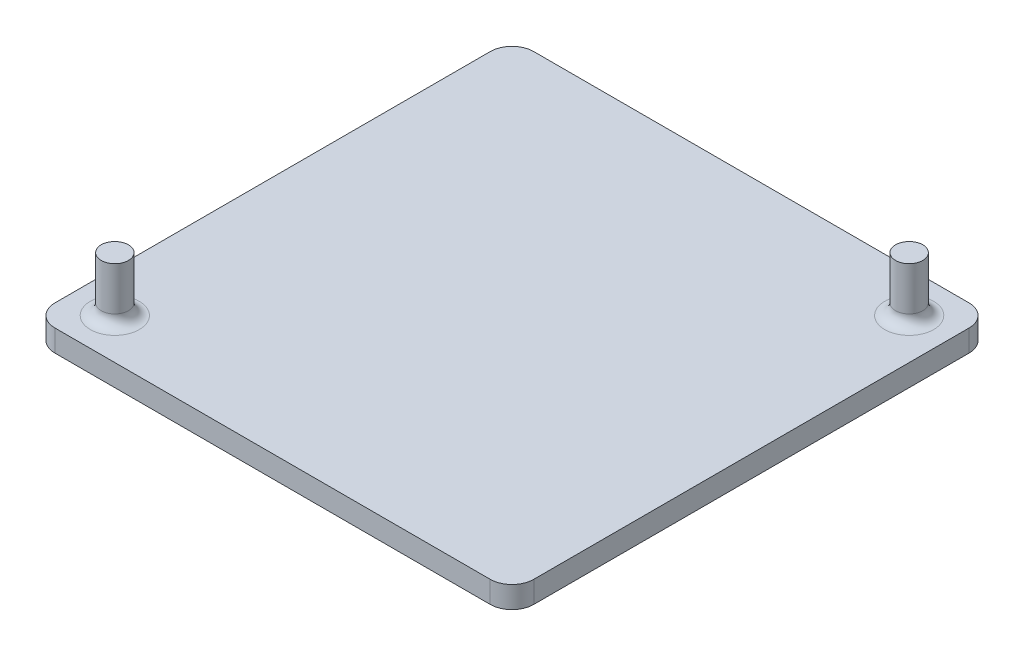
ISO-10303-21;
HEADER;
FILE_DESCRIPTION(('STEP AP214'),'2;1');
FILE_NAME('part.step','',(''),(''),'','','');
FILE_SCHEMA(('AUTOMOTIVE_DESIGN { 1 0 10303 214 1 1 1 1 }'));
ENDSEC;
DATA;
#1=APPLICATION_CONTEXT('core data for automotive mechanical design processes');
#2=APPLICATION_PROTOCOL_DEFINITION('international standard','automotive_design',2000,#1);
#3=PRODUCT_CONTEXT('',#1,'mechanical');
#4=PRODUCT('Part','Part','',(#3));
#5=PRODUCT_RELATED_PRODUCT_CATEGORY('part','',(#4));
#6=PRODUCT_DEFINITION_FORMATION('','',#4);
#7=PRODUCT_DEFINITION_CONTEXT('part definition',#1,'design');
#8=PRODUCT_DEFINITION('design','',#6,#7);
#9=PRODUCT_DEFINITION_SHAPE('','',#8);
#10=(LENGTH_UNIT() NAMED_UNIT(*) SI_UNIT(.MILLI.,.METRE.));
#11=(NAMED_UNIT(*) PLANE_ANGLE_UNIT() SI_UNIT($,.RADIAN.));
#12=(NAMED_UNIT(*) SI_UNIT($,.STERADIAN.) SOLID_ANGLE_UNIT());
#13=UNCERTAINTY_MEASURE_WITH_UNIT(LENGTH_MEASURE(1.E-05),#10,'distance_accuracy_value','');
#14=(GEOMETRIC_REPRESENTATION_CONTEXT(3) GLOBAL_UNCERTAINTY_ASSIGNED_CONTEXT((#13)) GLOBAL_UNIT_ASSIGNED_CONTEXT((#10,
#11,#12)) REPRESENTATION_CONTEXT('',''));
#15=CARTESIAN_POINT('',(0.,0.,0.));
#16=DIRECTION('',(0.,0.,1.));
#17=DIRECTION('',(1.,0.,0.));
#18=AXIS2_PLACEMENT_3D('',#15,#16,#17);
#19=CARTESIAN_POINT('',(0.,2.,0.));
#20=DIRECTION('',(1.,0.,0.));
#21=DIRECTION('',(0.,0.,-1.));
#22=AXIS2_PLACEMENT_3D('',#19,#20,#21);
#23=PLANE('',#22);
#24=DIRECTION('',(0.,0.,1.));
#25=VECTOR('',#24,1.);
#26=CARTESIAN_POINT('',(0.,2.,0.));
#27=LINE('',#26,#25);
#28=CARTESIAN_POINT('',(0.,2.,-42.));
#29=VERTEX_POINT('',#28);
#30=CARTESIAN_POINT('',(0.,2.,-2.));
#31=VERTEX_POINT('',#30);
#32=EDGE_CURVE('E134',#29,#31,#27,.T.);
#33=ORIENTED_EDGE('',*,*,#32,.F.);
#34=DIRECTION('',(0.,-1.,0.));
#35=VECTOR('',#34,1.);
#36=CARTESIAN_POINT('',(0.,2.,-42.));
#37=LINE('',#36,#35);
#38=CARTESIAN_POINT('',(0.,0.,-42.));
#39=VERTEX_POINT('',#38);
#40=EDGE_CURVE('E160',#29,#39,#37,.T.);
#41=ORIENTED_EDGE('',*,*,#40,.T.);
#42=DIRECTION('',(0.,0.,1.));
#43=VECTOR('',#42,1.);
#44=CARTESIAN_POINT('',(0.,0.,0.));
#45=LINE('',#44,#43);
#46=CARTESIAN_POINT('',(0.,0.,-2.));
#47=VERTEX_POINT('',#46);
#48=EDGE_CURVE('E194',#39,#47,#45,.T.);
#49=ORIENTED_EDGE('',*,*,#48,.T.);
#50=DIRECTION('',(0.,-1.,0.));
#51=VECTOR('',#50,1.);
#52=CARTESIAN_POINT('',(0.,2.,-2.));
#53=LINE('',#52,#51);
#54=EDGE_CURVE('E158',#47,#31,#53,.F.);
#55=ORIENTED_EDGE('',*,*,#54,.T.);
#56=EDGE_LOOP('',(#33,#41,#49,#55));
#57=FACE_BOUND('',#56,.T.);
#58=ADVANCED_FACE('F41',(#57),#23,.F.);
#59=CARTESIAN_POINT('',(0.,2.,0.));
#60=DIRECTION('',(0.,0.,-1.));
#61=DIRECTION('',(-1.,0.,0.));
#62=AXIS2_PLACEMENT_3D('',#59,#60,#61);
#63=PLANE('',#62);
#64=DIRECTION('',(1.,0.,0.));
#65=VECTOR('',#64,1.);
#66=CARTESIAN_POINT('',(0.,2.,0.));
#67=LINE('',#66,#65);
#68=CARTESIAN_POINT('',(2.,2.,0.));
#69=VERTEX_POINT('',#68);
#70=CARTESIAN_POINT('',(42.,2.,0.));
#71=VERTEX_POINT('',#70);
#72=EDGE_CURVE('E137',#69,#71,#67,.T.);
#73=ORIENTED_EDGE('',*,*,#72,.F.);
#74=DIRECTION('',(0.,-1.,0.));
#75=VECTOR('',#74,1.);
#76=CARTESIAN_POINT('',(2.,2.,0.));
#77=LINE('',#76,#75);
#78=CARTESIAN_POINT('',(2.,0.,0.));
#79=VERTEX_POINT('',#78);
#80=EDGE_CURVE('E164',#69,#79,#77,.T.);
#81=ORIENTED_EDGE('',*,*,#80,.T.);
#82=DIRECTION('',(1.,0.,0.));
#83=VECTOR('',#82,1.);
#84=CARTESIAN_POINT('',(0.,0.,0.));
#85=LINE('',#84,#83);
#86=CARTESIAN_POINT('',(42.,0.,0.));
#87=VERTEX_POINT('',#86);
#88=EDGE_CURVE('E139',#79,#87,#85,.T.);
#89=ORIENTED_EDGE('',*,*,#88,.T.);
#90=DIRECTION('',(0.,-1.,0.));
#91=VECTOR('',#90,1.);
#92=CARTESIAN_POINT('',(42.,2.,0.));
#93=LINE('',#92,#91);
#94=EDGE_CURVE('E56',#87,#71,#93,.F.);
#95=ORIENTED_EDGE('',*,*,#94,.T.);
#96=EDGE_LOOP('',(#73,#81,#89,#95));
#97=FACE_BOUND('',#96,.T.);
#98=ADVANCED_FACE('F207',(#97),#63,.F.);
#99=CARTESIAN_POINT('',(44.,2.,0.));
#100=DIRECTION('',(-1.,0.,0.));
#101=DIRECTION('',(0.,0.,1.));
#102=AXIS2_PLACEMENT_3D('',#99,#100,#101);
#103=PLANE('',#102);
#104=DIRECTION('',(0.,0.,-1.));
#105=VECTOR('',#104,1.);
#106=CARTESIAN_POINT('',(44.,0.,0.));
#107=LINE('',#106,#105);
#108=CARTESIAN_POINT('',(44.,0.,-2.));
#109=VERTEX_POINT('',#108);
#110=CARTESIAN_POINT('',(44.,0.,-42.));
#111=VERTEX_POINT('',#110);
#112=EDGE_CURVE('E135',#109,#111,#107,.T.);
#113=ORIENTED_EDGE('',*,*,#112,.T.);
#114=DIRECTION('',(0.,-1.,0.));
#115=VECTOR('',#114,1.);
#116=CARTESIAN_POINT('',(44.,2.,-42.));
#117=LINE('',#116,#115);
#118=CARTESIAN_POINT('',(44.,2.,-42.));
#119=VERTEX_POINT('',#118);
#120=EDGE_CURVE('E113',#111,#119,#117,.F.);
#121=ORIENTED_EDGE('',*,*,#120,.T.);
#122=DIRECTION('',(0.,0.,-1.));
#123=VECTOR('',#122,1.);
#124=CARTESIAN_POINT('',(44.,2.,0.));
#125=LINE('',#124,#123);
#126=CARTESIAN_POINT('',(44.,2.,-2.));
#127=VERTEX_POINT('',#126);
#128=EDGE_CURVE('E203',#127,#119,#125,.T.);
#129=ORIENTED_EDGE('',*,*,#128,.F.);
#130=DIRECTION('',(0.,-1.,0.));
#131=VECTOR('',#130,1.);
#132=CARTESIAN_POINT('',(44.,2.,-2.));
#133=LINE('',#132,#131);
#134=EDGE_CURVE('E118',#127,#109,#133,.T.);
#135=ORIENTED_EDGE('',*,*,#134,.T.);
#136=EDGE_LOOP('',(#113,#121,#129,#135));
#137=FACE_BOUND('',#136,.T.);
#138=ADVANCED_FACE('F214',(#137),#103,.F.);
#139=CARTESIAN_POINT('',(0.,2.,-44.));
#140=DIRECTION('',(0.,0.,1.));
#141=DIRECTION('',(1.,0.,0.));
#142=AXIS2_PLACEMENT_3D('',#139,#140,#141);
#143=PLANE('',#142);
#144=DIRECTION('',(-1.,0.,0.));
#145=VECTOR('',#144,1.);
#146=CARTESIAN_POINT('',(0.,2.,-44.));
#147=LINE('',#146,#145);
#148=CARTESIAN_POINT('',(42.,2.,-44.));
#149=VERTEX_POINT('',#148);
#150=CARTESIAN_POINT('',(2.,2.,-44.));
#151=VERTEX_POINT('',#150);
#152=EDGE_CURVE('E128',#149,#151,#147,.T.);
#153=ORIENTED_EDGE('',*,*,#152,.F.);
#154=DIRECTION('',(0.,-1.,0.));
#155=VECTOR('',#154,1.);
#156=CARTESIAN_POINT('',(42.,2.,-44.));
#157=LINE('',#156,#155);
#158=CARTESIAN_POINT('',(42.,0.,-44.));
#159=VERTEX_POINT('',#158);
#160=EDGE_CURVE('E112',#149,#159,#157,.T.);
#161=ORIENTED_EDGE('',*,*,#160,.T.);
#162=DIRECTION('',(-1.,0.,0.));
#163=VECTOR('',#162,1.);
#164=CARTESIAN_POINT('',(0.,0.,-44.));
#165=LINE('',#164,#163);
#166=CARTESIAN_POINT('',(2.,0.,-44.));
#167=VERTEX_POINT('',#166);
#168=EDGE_CURVE('E125',#159,#167,#165,.T.);
#169=ORIENTED_EDGE('',*,*,#168,.T.);
#170=DIRECTION('',(0.,-1.,0.));
#171=VECTOR('',#170,1.);
#172=CARTESIAN_POINT('',(2.,2.,-44.));
#173=LINE('',#172,#171);
#174=EDGE_CURVE('E130',#167,#151,#173,.F.);
#175=ORIENTED_EDGE('',*,*,#174,.T.);
#176=EDGE_LOOP('',(#153,#161,#169,#175));
#177=FACE_BOUND('',#176,.T.);
#178=ADVANCED_FACE('F124',(#177),#143,.F.);
#179=CARTESIAN_POINT('',(0.,2.,0.));
#180=DIRECTION('',(0.,-1.,0.));
#181=DIRECTION('',(0.,0.,-1.));
#182=AXIS2_PLACEMENT_3D('',#179,#180,#181);
#183=PLANE('',#182);
#184=CARTESIAN_POINT('',(3.75,2.,-3.75));
#185=DIRECTION('',(0.,-1.,0.));
#186=DIRECTION('',(0.,0.,-1.));
#187=AXIS2_PLACEMENT_3D('',#184,#185,#186);
#188=CIRCLE('',#187,2.25);
#189=CARTESIAN_POINT('',(3.75,2.,-6.));
#190=VERTEX_POINT('',#189);
#191=EDGE_CURVE('E49',#190,#190,#188,.T.);
#192=ORIENTED_EDGE('',*,*,#191,.T.);
#193=EDGE_LOOP('',(#192));
#194=FACE_BOUND('',#193,.T.);
#195=CARTESIAN_POINT('',(40.25,2.,-40.25));
#196=DIRECTION('',(0.,-1.,0.));
#197=DIRECTION('',(0.,0.,-1.));
#198=AXIS2_PLACEMENT_3D('',#195,#196,#197);
#199=CIRCLE('',#198,2.25);
#200=CARTESIAN_POINT('',(40.25,2.,-42.5));
#201=VERTEX_POINT('',#200);
#202=EDGE_CURVE('E170',#201,#201,#199,.T.);
#203=ORIENTED_EDGE('',*,*,#202,.T.);
#204=EDGE_LOOP('',(#203));
#205=FACE_BOUND('',#204,.T.);
#206=ORIENTED_EDGE('',*,*,#128,.T.);
#207=CARTESIAN_POINT('',(42.,2.,-42.));
#208=DIRECTION('',(0.,-1.,0.));
#209=DIRECTION('',(0.,0.,-1.));
#210=AXIS2_PLACEMENT_3D('',#207,#208,#209);
#211=CIRCLE('',#210,2.);
#212=EDGE_CURVE('E156',#119,#149,#211,.F.);
#213=ORIENTED_EDGE('',*,*,#212,.T.);
#214=ORIENTED_EDGE('',*,*,#152,.T.);
#215=CARTESIAN_POINT('',(2.,2.,-42.));
#216=DIRECTION('',(0.,-1.,0.));
#217=DIRECTION('',(0.,0.,-1.));
#218=AXIS2_PLACEMENT_3D('',#215,#216,#217);
#219=CIRCLE('',#218,2.);
#220=EDGE_CURVE('E154',#151,#29,#219,.F.);
#221=ORIENTED_EDGE('',*,*,#220,.T.);
#222=ORIENTED_EDGE('',*,*,#32,.T.);
#223=CARTESIAN_POINT('',(2.,2.,-2.));
#224=DIRECTION('',(0.,-1.,0.));
#225=DIRECTION('',(0.,0.,-1.));
#226=AXIS2_PLACEMENT_3D('',#223,#224,#225);
#227=CIRCLE('',#226,2.);
#228=EDGE_CURVE('E63',#31,#69,#227,.F.);
#229=ORIENTED_EDGE('',*,*,#228,.T.);
#230=ORIENTED_EDGE('',*,*,#72,.T.);
#231=CARTESIAN_POINT('',(42.,2.,-2.));
#232=DIRECTION('',(0.,-1.,0.));
#233=DIRECTION('',(0.,0.,-1.));
#234=AXIS2_PLACEMENT_3D('',#231,#232,#233);
#235=CIRCLE('',#234,2.);
#236=EDGE_CURVE('E151',#71,#127,#235,.F.);
#237=ORIENTED_EDGE('',*,*,#236,.T.);
#238=EDGE_LOOP('',(#206,#213,#214,#221,#222,#229,#230,#237));
#239=FACE_BOUND('',#238,.T.);
#240=ADVANCED_FACE('F175',(#194,#205,#239),#183,.F.);
#241=CARTESIAN_POINT('',(0.,0.,0.));
#242=DIRECTION('',(0.,-1.,0.));
#243=DIRECTION('',(0.,0.,-1.));
#244=AXIS2_PLACEMENT_3D('',#241,#242,#243);
#245=PLANE('',#244);
#246=ORIENTED_EDGE('',*,*,#168,.F.);
#247=CARTESIAN_POINT('',(42.,0.,-42.));
#248=DIRECTION('',(0.,-1.,0.));
#249=DIRECTION('',(0.,0.,-1.));
#250=AXIS2_PLACEMENT_3D('',#247,#248,#249);
#251=CIRCLE('',#250,2.);
#252=EDGE_CURVE('E108',#159,#111,#251,.T.);
#253=ORIENTED_EDGE('',*,*,#252,.T.);
#254=ORIENTED_EDGE('',*,*,#112,.F.);
#255=CARTESIAN_POINT('',(42.,0.,-2.));
#256=DIRECTION('',(0.,-1.,0.));
#257=DIRECTION('',(0.,0.,-1.));
#258=AXIS2_PLACEMENT_3D('',#255,#256,#257);
#259=CIRCLE('',#258,2.);
#260=EDGE_CURVE('E129',#109,#87,#259,.T.);
#261=ORIENTED_EDGE('',*,*,#260,.T.);
#262=ORIENTED_EDGE('',*,*,#88,.F.);
#263=CARTESIAN_POINT('',(2.,0.,-2.));
#264=DIRECTION('',(0.,-1.,0.));
#265=DIRECTION('',(0.,0.,-1.));
#266=AXIS2_PLACEMENT_3D('',#263,#264,#265);
#267=CIRCLE('',#266,2.);
#268=EDGE_CURVE('E145',#79,#47,#267,.T.);
#269=ORIENTED_EDGE('',*,*,#268,.T.);
#270=ORIENTED_EDGE('',*,*,#48,.F.);
#271=CARTESIAN_POINT('',(2.,0.,-42.));
#272=DIRECTION('',(0.,-1.,0.));
#273=DIRECTION('',(0.,0.,-1.));
#274=AXIS2_PLACEMENT_3D('',#271,#272,#273);
#275=CIRCLE('',#274,2.);
#276=EDGE_CURVE('E119',#39,#167,#275,.T.);
#277=ORIENTED_EDGE('',*,*,#276,.T.);
#278=EDGE_LOOP('',(#246,#253,#254,#261,#262,#269,#270,#277));
#279=FACE_BOUND('',#278,.T.);
#280=ADVANCED_FACE('F132',(#279),#245,.T.);
#281=CARTESIAN_POINT('',(40.25,7.,-40.25));
#282=DIRECTION('',(0.,-1.,0.));
#283=DIRECTION('',(0.,0.,-1.));
#284=AXIS2_PLACEMENT_3D('',#281,#282,#283);
#285=CYLINDRICAL_SURFACE('',#284,1.25);
#286=CARTESIAN_POINT('',(40.25,3.,-40.25));
#287=DIRECTION('',(0.,-1.,0.));
#288=DIRECTION('',(0.,0.,-1.));
#289=AXIS2_PLACEMENT_3D('',#286,#287,#288);
#290=CIRCLE('',#289,1.25);
#291=CARTESIAN_POINT('',(40.25,3.,-41.5));
#292=VERTEX_POINT('',#291);
#293=EDGE_CURVE('E11',#292,#292,#290,.F.);
#294=ORIENTED_EDGE('',*,*,#293,.T.);
#295=EDGE_LOOP('',(#294));
#296=FACE_BOUND('',#295,.T.);
#297=CARTESIAN_POINT('',(40.25,7.,-40.25));
#298=DIRECTION('',(0.,1.,0.));
#299=DIRECTION('',(0.,0.,1.));
#300=AXIS2_PLACEMENT_3D('',#297,#298,#299);
#301=CIRCLE('',#300,1.25);
#302=CARTESIAN_POINT('',(40.25,7.,-39.));
#303=VERTEX_POINT('',#302);
#304=EDGE_CURVE('E195',#303,#303,#301,.T.);
#305=ORIENTED_EDGE('',*,*,#304,.F.);
#306=EDGE_LOOP('',(#305));
#307=FACE_BOUND('',#306,.T.);
#308=ADVANCED_FACE('F260',(#296,#307),#285,.T.);
#309=CARTESIAN_POINT('',(40.25,7.,-40.25));
#310=DIRECTION('',(0.,1.,0.));
#311=DIRECTION('',(0.,0.,1.));
#312=AXIS2_PLACEMENT_3D('',#309,#310,#311);
#313=PLANE('',#312);
#314=ORIENTED_EDGE('',*,*,#304,.T.);
#315=EDGE_LOOP('',(#314));
#316=FACE_BOUND('',#315,.T.);
#317=ADVANCED_FACE('F188',(#316),#313,.T.);
#318=CARTESIAN_POINT('',(3.75,7.,-3.75));
#319=DIRECTION('',(0.,-1.,0.));
#320=DIRECTION('',(0.,0.,-1.));
#321=AXIS2_PLACEMENT_3D('',#318,#319,#320);
#322=CYLINDRICAL_SURFACE('',#321,1.25);
#323=CARTESIAN_POINT('',(3.75,3.,-3.75));
#324=DIRECTION('',(0.,-1.,0.));
#325=DIRECTION('',(0.,0.,-1.));
#326=AXIS2_PLACEMENT_3D('',#323,#324,#325);
#327=CIRCLE('',#326,1.25);
#328=CARTESIAN_POINT('',(3.75,3.,-5.));
#329=VERTEX_POINT('',#328);
#330=EDGE_CURVE('E167',#329,#329,#327,.F.);
#331=ORIENTED_EDGE('',*,*,#330,.T.);
#332=EDGE_LOOP('',(#331));
#333=FACE_BOUND('',#332,.T.);
#334=CARTESIAN_POINT('',(3.75,7.,-3.75));
#335=DIRECTION('',(0.,1.,0.));
#336=DIRECTION('',(0.,0.,1.));
#337=AXIS2_PLACEMENT_3D('',#334,#335,#336);
#338=CIRCLE('',#337,1.25);
#339=CARTESIAN_POINT('',(3.75,7.,-2.5));
#340=VERTEX_POINT('',#339);
#341=EDGE_CURVE('E192',#340,#340,#338,.T.);
#342=ORIENTED_EDGE('',*,*,#341,.F.);
#343=EDGE_LOOP('',(#342));
#344=FACE_BOUND('',#343,.T.);
#345=ADVANCED_FACE('F184',(#333,#344),#322,.T.);
#346=CARTESIAN_POINT('',(3.75,7.,-3.75));
#347=DIRECTION('',(0.,1.,0.));
#348=DIRECTION('',(0.,0.,1.));
#349=AXIS2_PLACEMENT_3D('',#346,#347,#348);
#350=PLANE('',#349);
#351=ORIENTED_EDGE('',*,*,#341,.T.);
#352=EDGE_LOOP('',(#351));
#353=FACE_BOUND('',#352,.T.);
#354=ADVANCED_FACE('F187',(#353),#350,.T.);
#355=CARTESIAN_POINT('',(42.,2.,-42.));
#356=DIRECTION('',(0.,-1.,0.));
#357=DIRECTION('',(0.,0.,-1.));
#358=AXIS2_PLACEMENT_3D('',#355,#356,#357);
#359=CYLINDRICAL_SURFACE('',#358,2.);
#360=ORIENTED_EDGE('',*,*,#212,.F.);
#361=ORIENTED_EDGE('',*,*,#120,.F.);
#362=ORIENTED_EDGE('',*,*,#252,.F.);
#363=ORIENTED_EDGE('',*,*,#160,.F.);
#364=EDGE_LOOP('',(#360,#361,#362,#363));
#365=FACE_BOUND('',#364,.T.);
#366=ADVANCED_FACE('F111',(#365),#359,.T.);
#367=CARTESIAN_POINT('',(2.,2.,-42.));
#368=DIRECTION('',(0.,-1.,0.));
#369=DIRECTION('',(0.,0.,-1.));
#370=AXIS2_PLACEMENT_3D('',#367,#368,#369);
#371=CYLINDRICAL_SURFACE('',#370,2.);
#372=ORIENTED_EDGE('',*,*,#220,.F.);
#373=ORIENTED_EDGE('',*,*,#174,.F.);
#374=ORIENTED_EDGE('',*,*,#276,.F.);
#375=ORIENTED_EDGE('',*,*,#40,.F.);
#376=EDGE_LOOP('',(#372,#373,#374,#375));
#377=FACE_BOUND('',#376,.T.);
#378=ADVANCED_FACE('F233',(#377),#371,.T.);
#379=CARTESIAN_POINT('',(2.,2.,-2.));
#380=DIRECTION('',(0.,-1.,0.));
#381=DIRECTION('',(0.,0.,-1.));
#382=AXIS2_PLACEMENT_3D('',#379,#380,#381);
#383=CYLINDRICAL_SURFACE('',#382,2.);
#384=ORIENTED_EDGE('',*,*,#228,.F.);
#385=ORIENTED_EDGE('',*,*,#54,.F.);
#386=ORIENTED_EDGE('',*,*,#268,.F.);
#387=ORIENTED_EDGE('',*,*,#80,.F.);
#388=EDGE_LOOP('',(#384,#385,#386,#387));
#389=FACE_BOUND('',#388,.T.);
#390=ADVANCED_FACE('F236',(#389),#383,.T.);
#391=CARTESIAN_POINT('',(42.,2.,-2.));
#392=DIRECTION('',(0.,-1.,0.));
#393=DIRECTION('',(0.,0.,-1.));
#394=AXIS2_PLACEMENT_3D('',#391,#392,#393);
#395=CYLINDRICAL_SURFACE('',#394,2.);
#396=ORIENTED_EDGE('',*,*,#236,.F.);
#397=ORIENTED_EDGE('',*,*,#94,.F.);
#398=ORIENTED_EDGE('',*,*,#260,.F.);
#399=ORIENTED_EDGE('',*,*,#134,.F.);
#400=EDGE_LOOP('',(#396,#397,#398,#399));
#401=FACE_BOUND('',#400,.T.);
#402=ADVANCED_FACE('F181',(#401),#395,.T.);
#403=CARTESIAN_POINT('',(3.75,3.,-3.75));
#404=DIRECTION('',(0.,-1.,0.));
#405=DIRECTION('',(0.,0.,-1.));
#406=AXIS2_PLACEMENT_3D('',#403,#404,#405);
#407=TOROIDAL_SURFACE('',#406,2.25,1.);
#408=ORIENTED_EDGE('',*,*,#191,.F.);
#409=EDGE_LOOP('',(#408));
#410=FACE_BOUND('',#409,.T.);
#411=ORIENTED_EDGE('',*,*,#330,.F.);
#412=EDGE_LOOP('',(#411));
#413=FACE_BOUND('',#412,.T.);
#414=ADVANCED_FACE('F178',(#410,#413),#407,.F.);
#415=CARTESIAN_POINT('',(40.25,3.,-40.25));
#416=DIRECTION('',(0.,-1.,0.));
#417=DIRECTION('',(0.,0.,-1.));
#418=AXIS2_PLACEMENT_3D('',#415,#416,#417);
#419=TOROIDAL_SURFACE('',#418,2.25,1.);
#420=ORIENTED_EDGE('',*,*,#202,.F.);
#421=EDGE_LOOP('',(#420));
#422=FACE_BOUND('',#421,.T.);
#423=ORIENTED_EDGE('',*,*,#293,.F.);
#424=EDGE_LOOP('',(#423));
#425=FACE_BOUND('',#424,.T.);
#426=ADVANCED_FACE('F43',(#422,#425),#419,.F.);
#427=CLOSED_SHELL('',(#58,#98,#138,#178,#240,#280,#308,#317,#345,#354,#366,#378,#390,#402,#414,#426));
#428=MANIFOLD_SOLID_BREP('B2',#427);
#429=ADVANCED_BREP_SHAPE_REPRESENTATION('',(#18,#428),#14);
#430=SHAPE_DEFINITION_REPRESENTATION(#9,#429);
ENDSEC;
END-ISO-10303-21;
